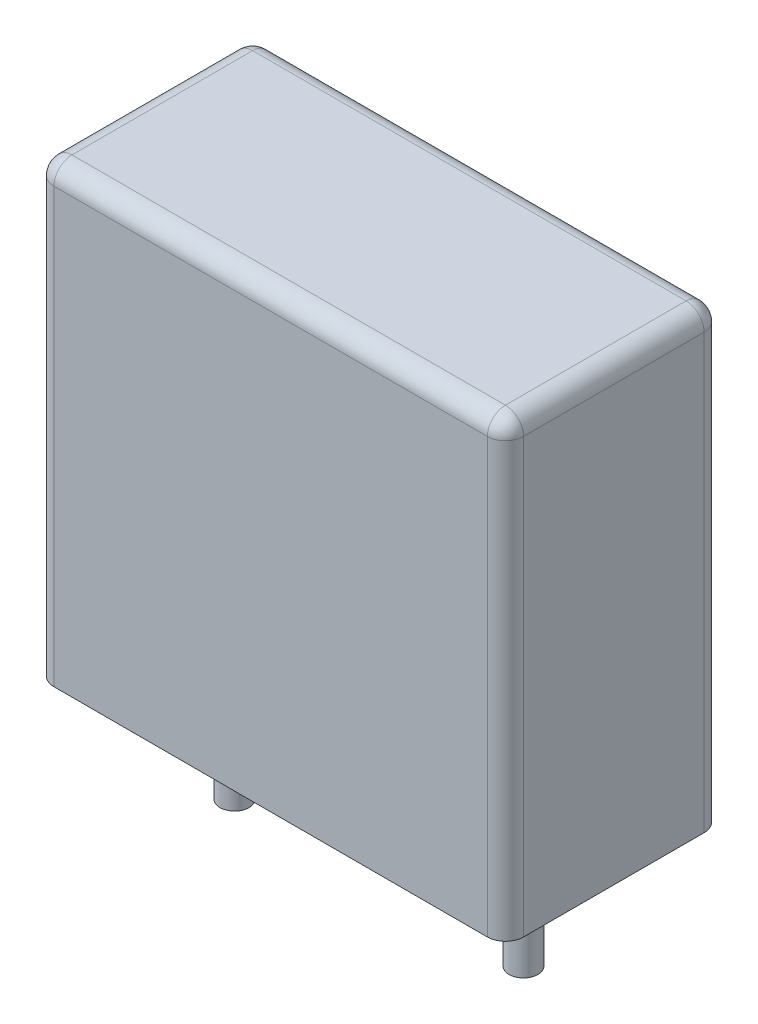
ISO-10303-21;
HEADER;
FILE_DESCRIPTION(('STEP AP214'),'2;1');
FILE_NAME('part.step','',(''),(''),'','','');
FILE_SCHEMA(('AUTOMOTIVE_DESIGN { 1 0 10303 214 1 1 1 1 }'));
ENDSEC;
DATA;
#1=APPLICATION_CONTEXT('core data for automotive mechanical design processes');
#2=APPLICATION_PROTOCOL_DEFINITION('international standard','automotive_design',2000,#1);
#3=PRODUCT_CONTEXT('',#1,'mechanical');
#4=PRODUCT('Part','Part','',(#3));
#5=PRODUCT_RELATED_PRODUCT_CATEGORY('part','',(#4));
#6=PRODUCT_DEFINITION_FORMATION('','',#4);
#7=PRODUCT_DEFINITION_CONTEXT('part definition',#1,'design');
#8=PRODUCT_DEFINITION('design','',#6,#7);
#9=PRODUCT_DEFINITION_SHAPE('','',#8);
#10=(LENGTH_UNIT() NAMED_UNIT(*) SI_UNIT(.MILLI.,.METRE.));
#11=(NAMED_UNIT(*) PLANE_ANGLE_UNIT() SI_UNIT($,.RADIAN.));
#12=(NAMED_UNIT(*) SI_UNIT($,.STERADIAN.) SOLID_ANGLE_UNIT());
#13=UNCERTAINTY_MEASURE_WITH_UNIT(LENGTH_MEASURE(1.E-05),#10,'distance_accuracy_value','');
#14=(GEOMETRIC_REPRESENTATION_CONTEXT(3) GLOBAL_UNCERTAINTY_ASSIGNED_CONTEXT((#13)) GLOBAL_UNIT_ASSIGNED_CONTEXT((#10,
#11,#12)) REPRESENTATION_CONTEXT('',''));
#15=CARTESIAN_POINT('',(0.,0.,0.));
#16=DIRECTION('',(0.,0.,1.));
#17=DIRECTION('',(1.,0.,0.));
#18=AXIS2_PLACEMENT_3D('',#15,#16,#17);
#19=CARTESIAN_POINT('',(6.5,12.5,3.));
#20=DIRECTION('',(-1.,0.,0.));
#21=DIRECTION('',(0.,0.,1.));
#22=AXIS2_PLACEMENT_3D('',#19,#20,#21);
#23=PLANE('',#22);
#24=DIRECTION('',(0.,0.,-1.));
#25=VECTOR('',#24,1.);
#26=CARTESIAN_POINT('',(6.5,0.,3.));
#27=LINE('',#26,#25);
#28=CARTESIAN_POINT('',(6.5,0.,2.5));
#29=VERTEX_POINT('',#28);
#30=CARTESIAN_POINT('',(6.5,0.,-2.5));
#31=VERTEX_POINT('',#30);
#32=EDGE_CURVE('E252',#29,#31,#27,.T.);
#33=ORIENTED_EDGE('',*,*,#32,.T.);
#34=DIRECTION('',(0.,-1.,0.));
#35=VECTOR('',#34,1.);
#36=CARTESIAN_POINT('',(6.5,12.5,-2.5));
#37=LINE('',#36,#35);
#38=CARTESIAN_POINT('',(6.5,12.,-2.5));
#39=VERTEX_POINT('',#38);
#40=EDGE_CURVE('E57',#31,#39,#37,.F.);
#41=ORIENTED_EDGE('',*,*,#40,.T.);
#42=DIRECTION('',(0.,0.,-1.));
#43=VECTOR('',#42,1.);
#44=CARTESIAN_POINT('',(6.5,12.,3.));
#45=LINE('',#44,#43);
#46=CARTESIAN_POINT('',(6.5,12.,2.5));
#47=VERTEX_POINT('',#46);
#48=EDGE_CURVE('E62',#39,#47,#45,.F.);
#49=ORIENTED_EDGE('',*,*,#48,.T.);
#50=DIRECTION('',(0.,-1.,0.));
#51=VECTOR('',#50,1.);
#52=CARTESIAN_POINT('',(6.5,12.5,2.5));
#53=LINE('',#52,#51);
#54=EDGE_CURVE('E188',#47,#29,#53,.T.);
#55=ORIENTED_EDGE('',*,*,#54,.T.);
#56=EDGE_LOOP('',(#33,#41,#49,#55));
#57=FACE_BOUND('',#56,.T.);
#58=ADVANCED_FACE('F39',(#57),#23,.F.);
#59=CARTESIAN_POINT('',(-6.5,12.5,-3.));
#60=DIRECTION('',(0.,0.,1.));
#61=DIRECTION('',(1.,0.,0.));
#62=AXIS2_PLACEMENT_3D('',#59,#60,#61);
#63=PLANE('',#62);
#64=DIRECTION('',(-1.,0.,0.));
#65=VECTOR('',#64,1.);
#66=CARTESIAN_POINT('',(-6.5,0.,-3.));
#67=LINE('',#66,#65);
#68=CARTESIAN_POINT('',(5.99999999999999,0.,-3.));
#69=VERTEX_POINT('',#68);
#70=CARTESIAN_POINT('',(-6.,0.,-3.));
#71=VERTEX_POINT('',#70);
#72=EDGE_CURVE('E258',#69,#71,#67,.T.);
#73=ORIENTED_EDGE('',*,*,#72,.T.);
#74=DIRECTION('',(0.,-1.,0.));
#75=VECTOR('',#74,1.);
#76=CARTESIAN_POINT('',(-6.,12.5,-3.));
#77=LINE('',#76,#75);
#78=CARTESIAN_POINT('',(-6.,12.,-3.));
#79=VERTEX_POINT('',#78);
#80=EDGE_CURVE('E185',#71,#79,#77,.F.);
#81=ORIENTED_EDGE('',*,*,#80,.T.);
#82=DIRECTION('',(-1.,0.,0.));
#83=VECTOR('',#82,1.);
#84=CARTESIAN_POINT('',(-6.5,12.,-3.));
#85=LINE('',#84,#83);
#86=CARTESIAN_POINT('',(5.99999999999999,12.,-3.));
#87=VERTEX_POINT('',#86);
#88=EDGE_CURVE('E182',#79,#87,#85,.F.);
#89=ORIENTED_EDGE('',*,*,#88,.T.);
#90=DIRECTION('',(0.,-1.,0.));
#91=VECTOR('',#90,1.);
#92=CARTESIAN_POINT('',(5.99999999999999,12.5,-3.));
#93=LINE('',#92,#91);
#94=EDGE_CURVE('E179',#87,#69,#93,.T.);
#95=ORIENTED_EDGE('',*,*,#94,.T.);
#96=EDGE_LOOP('',(#73,#81,#89,#95));
#97=FACE_BOUND('',#96,.T.);
#98=ADVANCED_FACE('F313',(#97),#63,.F.);
#99=CARTESIAN_POINT('',(-6.5,12.5,3.));
#100=DIRECTION('',(1.,0.,0.));
#101=DIRECTION('',(0.,0.,-1.));
#102=AXIS2_PLACEMENT_3D('',#99,#100,#101);
#103=PLANE('',#102);
#104=DIRECTION('',(0.,0.,1.));
#105=VECTOR('',#104,1.);
#106=CARTESIAN_POINT('',(-6.5,12.,3.));
#107=LINE('',#106,#105);
#108=CARTESIAN_POINT('',(-6.5,12.,2.5));
#109=VERTEX_POINT('',#108);
#110=CARTESIAN_POINT('',(-6.5,12.,-2.5));
#111=VERTEX_POINT('',#110);
#112=EDGE_CURVE('E173',#109,#111,#107,.F.);
#113=ORIENTED_EDGE('',*,*,#112,.T.);
#114=DIRECTION('',(0.,-1.,0.));
#115=VECTOR('',#114,1.);
#116=CARTESIAN_POINT('',(-6.5,12.5,-2.5));
#117=LINE('',#116,#115);
#118=CARTESIAN_POINT('',(-6.5,0.,-2.5));
#119=VERTEX_POINT('',#118);
#120=EDGE_CURVE('E176',#111,#119,#117,.T.);
#121=ORIENTED_EDGE('',*,*,#120,.T.);
#122=DIRECTION('',(0.,0.,1.));
#123=VECTOR('',#122,1.);
#124=CARTESIAN_POINT('',(-6.5,0.,3.));
#125=LINE('',#124,#123);
#126=CARTESIAN_POINT('',(-6.5,0.,2.5));
#127=VERTEX_POINT('',#126);
#128=EDGE_CURVE('E262',#119,#127,#125,.T.);
#129=ORIENTED_EDGE('',*,*,#128,.T.);
#130=DIRECTION('',(0.,-1.,0.));
#131=VECTOR('',#130,1.);
#132=CARTESIAN_POINT('',(-6.5,12.5,2.5));
#133=LINE('',#132,#131);
#134=EDGE_CURVE('E170',#127,#109,#133,.F.);
#135=ORIENTED_EDGE('',*,*,#134,.T.);
#136=EDGE_LOOP('',(#113,#121,#129,#135));
#137=FACE_BOUND('',#136,.T.);
#138=ADVANCED_FACE('F318',(#137),#103,.F.);
#139=CARTESIAN_POINT('',(-6.5,12.5,3.));
#140=DIRECTION('',(0.,0.,-1.));
#141=DIRECTION('',(-1.,0.,0.));
#142=AXIS2_PLACEMENT_3D('',#139,#140,#141);
#143=PLANE('',#142);
#144=DIRECTION('',(1.,0.,0.));
#145=VECTOR('',#144,1.);
#146=CARTESIAN_POINT('',(-6.5,0.,3.));
#147=LINE('',#146,#145);
#148=CARTESIAN_POINT('',(-6.,0.,3.));
#149=VERTEX_POINT('',#148);
#150=CARTESIAN_POINT('',(5.99999999999999,0.,3.));
#151=VERTEX_POINT('',#150);
#152=EDGE_CURVE('E150',#149,#151,#147,.T.);
#153=ORIENTED_EDGE('',*,*,#152,.T.);
#154=DIRECTION('',(0.,-1.,0.));
#155=VECTOR('',#154,1.);
#156=CARTESIAN_POINT('',(5.99999999999999,12.5,3.));
#157=LINE('',#156,#155);
#158=CARTESIAN_POINT('',(5.99999999999999,12.,3.));
#159=VERTEX_POINT('',#158);
#160=EDGE_CURVE('E167',#151,#159,#157,.F.);
#161=ORIENTED_EDGE('',*,*,#160,.T.);
#162=DIRECTION('',(1.,0.,0.));
#163=VECTOR('',#162,1.);
#164=CARTESIAN_POINT('',(-6.5,12.,3.));
#165=LINE('',#164,#163);
#166=CARTESIAN_POINT('',(-6.,12.,3.));
#167=VERTEX_POINT('',#166);
#168=EDGE_CURVE('E125',#159,#167,#165,.F.);
#169=ORIENTED_EDGE('',*,*,#168,.T.);
#170=DIRECTION('',(0.,-1.,0.));
#171=VECTOR('',#170,1.);
#172=CARTESIAN_POINT('',(-6.,12.5,3.));
#173=LINE('',#172,#171);
#174=EDGE_CURVE('E157',#167,#149,#173,.T.);
#175=ORIENTED_EDGE('',*,*,#174,.T.);
#176=EDGE_LOOP('',(#153,#161,#169,#175));
#177=FACE_BOUND('',#176,.T.);
#178=ADVANCED_FACE('F288',(#177),#143,.F.);
#179=CARTESIAN_POINT('',(0.,12.5,0.));
#180=DIRECTION('',(0.,-1.,0.));
#181=DIRECTION('',(0.,0.,-1.));
#182=AXIS2_PLACEMENT_3D('',#179,#180,#181);
#183=PLANE('',#182);
#184=DIRECTION('',(0.,0.,1.));
#185=VECTOR('',#184,1.);
#186=CARTESIAN_POINT('',(-6.,12.5,0.));
#187=LINE('',#186,#185);
#188=CARTESIAN_POINT('',(-6.,12.5,-2.5));
#189=VERTEX_POINT('',#188);
#190=CARTESIAN_POINT('',(-6.,12.5,2.5));
#191=VERTEX_POINT('',#190);
#192=EDGE_CURVE('E154',#189,#191,#187,.T.);
#193=ORIENTED_EDGE('',*,*,#192,.T.);
#194=DIRECTION('',(1.,0.,0.));
#195=VECTOR('',#194,1.);
#196=CARTESIAN_POINT('',(0.,12.5,2.5));
#197=LINE('',#196,#195);
#198=CARTESIAN_POINT('',(5.99999999999999,12.5,2.5));
#199=VERTEX_POINT('',#198);
#200=EDGE_CURVE('E123',#191,#199,#197,.T.);
#201=ORIENTED_EDGE('',*,*,#200,.T.);
#202=DIRECTION('',(0.,0.,-1.));
#203=VECTOR('',#202,1.);
#204=CARTESIAN_POINT('',(5.99999999999999,12.5,0.));
#205=LINE('',#204,#203);
#206=CARTESIAN_POINT('',(5.99999999999999,12.5,-2.5));
#207=VERTEX_POINT('',#206);
#208=EDGE_CURVE('E142',#199,#207,#205,.T.);
#209=ORIENTED_EDGE('',*,*,#208,.T.);
#210=DIRECTION('',(-1.,0.,0.));
#211=VECTOR('',#210,1.);
#212=CARTESIAN_POINT('',(0.,12.5,-2.5));
#213=LINE('',#212,#211);
#214=EDGE_CURVE('E149',#207,#189,#213,.T.);
#215=ORIENTED_EDGE('',*,*,#214,.T.);
#216=EDGE_LOOP('',(#193,#201,#209,#215));
#217=FACE_BOUND('',#216,.T.);
#218=ADVANCED_FACE('F152',(#217),#183,.F.);
#219=CARTESIAN_POINT('',(0.,0.,0.));
#220=DIRECTION('',(0.,-1.,0.));
#221=DIRECTION('',(0.,0.,-1.));
#222=AXIS2_PLACEMENT_3D('',#219,#220,#221);
#223=PLANE('',#222);
#224=CARTESIAN_POINT('',(4.,0.,0.));
#225=DIRECTION('',(0.,-1.,0.));
#226=DIRECTION('',(0.,0.,-1.));
#227=AXIS2_PLACEMENT_3D('',#224,#225,#226);
#228=CIRCLE('',#227,0.4);
#229=CARTESIAN_POINT('',(4.,0.,-0.399999999999999));
#230=VERTEX_POINT('',#229);
#231=EDGE_CURVE('E235',#230,#230,#228,.T.);
#232=ORIENTED_EDGE('',*,*,#231,.F.);
#233=EDGE_LOOP('',(#232));
#234=FACE_BOUND('',#233,.T.);
#235=CARTESIAN_POINT('',(-4.,0.,0.));
#236=DIRECTION('',(0.,-1.,0.));
#237=DIRECTION('',(0.,0.,-1.));
#238=AXIS2_PLACEMENT_3D('',#235,#236,#237);
#239=CIRCLE('',#238,0.4);
#240=CARTESIAN_POINT('',(-4.,0.,-0.4));
#241=VERTEX_POINT('',#240);
#242=EDGE_CURVE('E245',#241,#241,#239,.T.);
#243=ORIENTED_EDGE('',*,*,#242,.F.);
#244=EDGE_LOOP('',(#243));
#245=FACE_BOUND('',#244,.T.);
#246=ORIENTED_EDGE('',*,*,#128,.F.);
#247=CARTESIAN_POINT('',(-6.,0.,-2.5));
#248=DIRECTION('',(0.,-1.,0.));
#249=DIRECTION('',(0.,0.,-1.));
#250=AXIS2_PLACEMENT_3D('',#247,#248,#249);
#251=CIRCLE('',#250,0.5);
#252=EDGE_CURVE('E11',#119,#71,#251,.T.);
#253=ORIENTED_EDGE('',*,*,#252,.T.);
#254=ORIENTED_EDGE('',*,*,#72,.F.);
#255=CARTESIAN_POINT('',(5.99999999999999,0.,-2.5));
#256=DIRECTION('',(0.,-1.,0.));
#257=DIRECTION('',(0.,0.,-1.));
#258=AXIS2_PLACEMENT_3D('',#255,#256,#257);
#259=CIRCLE('',#258,0.5);
#260=EDGE_CURVE('E49',#69,#31,#259,.T.);
#261=ORIENTED_EDGE('',*,*,#260,.T.);
#262=ORIENTED_EDGE('',*,*,#32,.F.);
#263=CARTESIAN_POINT('',(5.99999999999999,0.,2.5));
#264=DIRECTION('',(0.,-1.,0.));
#265=DIRECTION('',(0.,0.,-1.));
#266=AXIS2_PLACEMENT_3D('',#263,#264,#265);
#267=CIRCLE('',#266,0.5);
#268=EDGE_CURVE('E198',#29,#151,#267,.T.);
#269=ORIENTED_EDGE('',*,*,#268,.T.);
#270=ORIENTED_EDGE('',*,*,#152,.F.);
#271=CARTESIAN_POINT('',(-6.,0.,2.5));
#272=DIRECTION('',(0.,-1.,0.));
#273=DIRECTION('',(0.,0.,-1.));
#274=AXIS2_PLACEMENT_3D('',#271,#272,#273);
#275=CIRCLE('',#274,0.5);
#276=EDGE_CURVE('E195',#149,#127,#275,.T.);
#277=ORIENTED_EDGE('',*,*,#276,.T.);
#278=EDGE_LOOP('',(#246,#253,#254,#261,#262,#269,#270,#277));
#279=FACE_BOUND('',#278,.T.);
#280=ADVANCED_FACE('F296',(#234,#245,#279),#223,.T.);
#281=CARTESIAN_POINT('',(-4.,-3.2,0.));
#282=DIRECTION('',(0.,1.,0.));
#283=DIRECTION('',(0.,0.,1.));
#284=AXIS2_PLACEMENT_3D('',#281,#282,#283);
#285=CYLINDRICAL_SURFACE('',#284,0.4);
#286=CARTESIAN_POINT('',(-4.,-3.2,0.));
#287=DIRECTION('',(0.,-1.,0.));
#288=DIRECTION('',(0.,0.,-1.));
#289=AXIS2_PLACEMENT_3D('',#286,#287,#288);
#290=CIRCLE('',#289,0.4);
#291=CARTESIAN_POINT('',(-4.,-3.2,-0.4));
#292=VERTEX_POINT('',#291);
#293=EDGE_CURVE('E248',#292,#292,#290,.T.);
#294=ORIENTED_EDGE('',*,*,#293,.F.);
#295=EDGE_LOOP('',(#294));
#296=FACE_BOUND('',#295,.T.);
#297=ORIENTED_EDGE('',*,*,#242,.T.);
#298=EDGE_LOOP('',(#297));
#299=FACE_BOUND('',#298,.T.);
#300=ADVANCED_FACE('F431',(#296,#299),#285,.T.);
#301=CARTESIAN_POINT('',(-4.,-3.2,0.));
#302=DIRECTION('',(0.,-1.,0.));
#303=DIRECTION('',(0.,0.,-1.));
#304=AXIS2_PLACEMENT_3D('',#301,#302,#303);
#305=PLANE('',#304);
#306=ORIENTED_EDGE('',*,*,#293,.T.);
#307=EDGE_LOOP('',(#306));
#308=FACE_BOUND('',#307,.T.);
#309=ADVANCED_FACE('F422',(#308),#305,.T.);
#310=CARTESIAN_POINT('',(4.,-3.2,0.));
#311=DIRECTION('',(0.,1.,0.));
#312=DIRECTION('',(0.,0.,1.));
#313=AXIS2_PLACEMENT_3D('',#310,#311,#312);
#314=CYLINDRICAL_SURFACE('',#313,0.4);
#315=CARTESIAN_POINT('',(4.,-3.2,0.));
#316=DIRECTION('',(0.,-1.,0.));
#317=DIRECTION('',(0.,0.,-1.));
#318=AXIS2_PLACEMENT_3D('',#315,#316,#317);
#319=CIRCLE('',#318,0.4);
#320=CARTESIAN_POINT('',(4.,-3.2,-0.399999999999999));
#321=VERTEX_POINT('',#320);
#322=EDGE_CURVE('E239',#321,#321,#319,.T.);
#323=ORIENTED_EDGE('',*,*,#322,.F.);
#324=EDGE_LOOP('',(#323));
#325=FACE_BOUND('',#324,.T.);
#326=ORIENTED_EDGE('',*,*,#231,.T.);
#327=EDGE_LOOP('',(#326));
#328=FACE_BOUND('',#327,.T.);
#329=ADVANCED_FACE('F413',(#325,#328),#314,.T.);
#330=CARTESIAN_POINT('',(4.,-3.2,0.));
#331=DIRECTION('',(0.,-1.,0.));
#332=DIRECTION('',(0.,0.,-1.));
#333=AXIS2_PLACEMENT_3D('',#330,#331,#332);
#334=PLANE('',#333);
#335=ORIENTED_EDGE('',*,*,#322,.T.);
#336=EDGE_LOOP('',(#335));
#337=FACE_BOUND('',#336,.T.);
#338=ADVANCED_FACE('F404',(#337),#334,.T.);
#339=CARTESIAN_POINT('',(-6.,12.5,-2.5));
#340=DIRECTION('',(0.,-1.,0.));
#341=DIRECTION('',(0.,0.,-1.));
#342=AXIS2_PLACEMENT_3D('',#339,#340,#341);
#343=CYLINDRICAL_SURFACE('',#342,0.5);
#344=ORIENTED_EDGE('',*,*,#252,.F.);
#345=ORIENTED_EDGE('',*,*,#120,.F.);
#346=CARTESIAN_POINT('',(-6.,12.,-2.5));
#347=DIRECTION('',(0.,1.,0.));
#348=DIRECTION('',(0.,0.,1.));
#349=AXIS2_PLACEMENT_3D('',#346,#347,#348);
#350=CIRCLE('',#349,0.5);
#351=EDGE_CURVE('E43',#79,#111,#350,.T.);
#352=ORIENTED_EDGE('',*,*,#351,.F.);
#353=ORIENTED_EDGE('',*,*,#80,.F.);
#354=EDGE_LOOP('',(#344,#345,#352,#353));
#355=FACE_BOUND('',#354,.T.);
#356=ADVANCED_FACE('F41',(#355),#343,.T.);
#357=CARTESIAN_POINT('',(0.,12.,-2.5));
#358=DIRECTION('',(-1.,0.,0.));
#359=DIRECTION('',(0.,0.,1.));
#360=AXIS2_PLACEMENT_3D('',#357,#358,#359);
#361=CYLINDRICAL_SURFACE('',#360,0.5);
#362=CARTESIAN_POINT('',(5.99999999999999,12.,-2.5));
#363=DIRECTION('',(1.,0.,0.));
#364=DIRECTION('',(0.,0.,-1.));
#365=AXIS2_PLACEMENT_3D('',#362,#363,#364);
#366=CIRCLE('',#365,0.5);
#367=EDGE_CURVE('E224',#87,#207,#366,.T.);
#368=ORIENTED_EDGE('',*,*,#367,.F.);
#369=ORIENTED_EDGE('',*,*,#88,.F.);
#370=CARTESIAN_POINT('',(-6.,12.,-2.5));
#371=DIRECTION('',(-1.,0.,0.));
#372=DIRECTION('',(0.,0.,1.));
#373=AXIS2_PLACEMENT_3D('',#370,#371,#372);
#374=CIRCLE('',#373,0.5);
#375=EDGE_CURVE('E227',#189,#79,#374,.T.);
#376=ORIENTED_EDGE('',*,*,#375,.F.);
#377=ORIENTED_EDGE('',*,*,#214,.F.);
#378=EDGE_LOOP('',(#368,#369,#376,#377));
#379=FACE_BOUND('',#378,.T.);
#380=ADVANCED_FACE('F272',(#379),#361,.T.);
#381=CARTESIAN_POINT('',(5.99999999999999,12.5,-2.5));
#382=DIRECTION('',(0.,-1.,0.));
#383=DIRECTION('',(0.,0.,-1.));
#384=AXIS2_PLACEMENT_3D('',#381,#382,#383);
#385=CYLINDRICAL_SURFACE('',#384,0.5);
#386=ORIENTED_EDGE('',*,*,#260,.F.);
#387=ORIENTED_EDGE('',*,*,#94,.F.);
#388=CARTESIAN_POINT('',(5.99999999999999,12.,-2.5));
#389=DIRECTION('',(0.,1.,0.));
#390=DIRECTION('',(0.,0.,1.));
#391=AXIS2_PLACEMENT_3D('',#388,#389,#390);
#392=CIRCLE('',#391,0.5);
#393=EDGE_CURVE('E220',#39,#87,#392,.T.);
#394=ORIENTED_EDGE('',*,*,#393,.F.);
#395=ORIENTED_EDGE('',*,*,#40,.F.);
#396=EDGE_LOOP('',(#386,#387,#394,#395));
#397=FACE_BOUND('',#396,.T.);
#398=ADVANCED_FACE('F301',(#397),#385,.T.);
#399=CARTESIAN_POINT('',(-6.,12.,-2.5));
#400=DIRECTION('',(0.,0.,1.));
#401=DIRECTION('',(1.,0.,0.));
#402=AXIS2_PLACEMENT_3D('',#399,#400,#401);
#403=SPHERICAL_SURFACE('',#402,0.5);
#404=ORIENTED_EDGE('',*,*,#375,.T.);
#405=ORIENTED_EDGE('',*,*,#351,.T.);
#406=CARTESIAN_POINT('',(-6.,12.,-2.5));
#407=DIRECTION('',(0.,0.,-1.));
#408=DIRECTION('',(0.,1.,0.));
#409=AXIS2_PLACEMENT_3D('',#406,#407,#408);
#410=CIRCLE('',#409,0.5);
#411=EDGE_CURVE('E216',#189,#111,#410,.F.);
#412=ORIENTED_EDGE('',*,*,#411,.F.);
#413=EDGE_LOOP('',(#404,#405,#412));
#414=FACE_BOUND('',#413,.T.);
#415=ADVANCED_FACE('F273',(#414),#403,.T.);
#416=CARTESIAN_POINT('',(5.99999999999999,12.,-2.5));
#417=DIRECTION('',(0.,0.,1.));
#418=DIRECTION('',(1.,0.,0.));
#419=AXIS2_PLACEMENT_3D('',#416,#417,#418);
#420=SPHERICAL_SURFACE('',#419,0.5);
#421=ORIENTED_EDGE('',*,*,#393,.T.);
#422=ORIENTED_EDGE('',*,*,#367,.T.);
#423=CARTESIAN_POINT('',(5.99999999999999,12.,-2.5));
#424=DIRECTION('',(0.,0.,-1.));
#425=DIRECTION('',(-1.,0.,0.));
#426=AXIS2_PLACEMENT_3D('',#423,#424,#425);
#427=CIRCLE('',#426,0.5);
#428=EDGE_CURVE('E145',#39,#207,#427,.F.);
#429=ORIENTED_EDGE('',*,*,#428,.F.);
#430=EDGE_LOOP('',(#421,#422,#429));
#431=FACE_BOUND('',#430,.T.);
#432=ADVANCED_FACE('F303',(#431),#420,.T.);
#433=CARTESIAN_POINT('',(-6.,12.5,2.5));
#434=DIRECTION('',(0.,-1.,0.));
#435=DIRECTION('',(0.,0.,-1.));
#436=AXIS2_PLACEMENT_3D('',#433,#434,#435);
#437=CYLINDRICAL_SURFACE('',#436,0.5);
#438=ORIENTED_EDGE('',*,*,#276,.F.);
#439=ORIENTED_EDGE('',*,*,#174,.F.);
#440=CARTESIAN_POINT('',(-6.,12.,2.5));
#441=DIRECTION('',(0.,1.,0.));
#442=DIRECTION('',(0.,0.,1.));
#443=AXIS2_PLACEMENT_3D('',#440,#441,#442);
#444=CIRCLE('',#443,0.5);
#445=EDGE_CURVE('E210',#109,#167,#444,.T.);
#446=ORIENTED_EDGE('',*,*,#445,.F.);
#447=ORIENTED_EDGE('',*,*,#134,.F.);
#448=EDGE_LOOP('',(#438,#439,#446,#447));
#449=FACE_BOUND('',#448,.T.);
#450=ADVANCED_FACE('F285',(#449),#437,.T.);
#451=CARTESIAN_POINT('',(-6.,12.,0.));
#452=DIRECTION('',(0.,0.,1.));
#453=DIRECTION('',(1.,0.,0.));
#454=AXIS2_PLACEMENT_3D('',#451,#452,#453);
#455=CYLINDRICAL_SURFACE('',#454,0.5);
#456=ORIENTED_EDGE('',*,*,#411,.T.);
#457=ORIENTED_EDGE('',*,*,#112,.F.);
#458=CARTESIAN_POINT('',(-6.,12.,2.5));
#459=DIRECTION('',(0.,0.,1.));
#460=DIRECTION('',(1.,0.,0.));
#461=AXIS2_PLACEMENT_3D('',#458,#459,#460);
#462=CIRCLE('',#461,0.5);
#463=EDGE_CURVE('E139',#191,#109,#462,.T.);
#464=ORIENTED_EDGE('',*,*,#463,.F.);
#465=ORIENTED_EDGE('',*,*,#192,.F.);
#466=EDGE_LOOP('',(#456,#457,#464,#465));
#467=FACE_BOUND('',#466,.T.);
#468=ADVANCED_FACE('F276',(#467),#455,.T.);
#469=CARTESIAN_POINT('',(5.99999999999999,12.,0.));
#470=DIRECTION('',(0.,0.,-1.));
#471=DIRECTION('',(-1.,0.,0.));
#472=AXIS2_PLACEMENT_3D('',#469,#470,#471);
#473=CYLINDRICAL_SURFACE('',#472,0.5);
#474=ORIENTED_EDGE('',*,*,#428,.T.);
#475=ORIENTED_EDGE('',*,*,#208,.F.);
#476=CARTESIAN_POINT('',(5.99999999999999,12.,2.5));
#477=DIRECTION('',(0.,0.,1.));
#478=DIRECTION('',(1.,0.,0.));
#479=AXIS2_PLACEMENT_3D('',#476,#477,#478);
#480=CIRCLE('',#479,0.5);
#481=EDGE_CURVE('E132',#47,#199,#480,.T.);
#482=ORIENTED_EDGE('',*,*,#481,.F.);
#483=ORIENTED_EDGE('',*,*,#48,.F.);
#484=EDGE_LOOP('',(#474,#475,#482,#483));
#485=FACE_BOUND('',#484,.T.);
#486=ADVANCED_FACE('F143',(#485),#473,.T.);
#487=CARTESIAN_POINT('',(5.99999999999999,12.5,2.5));
#488=DIRECTION('',(0.,-1.,0.));
#489=DIRECTION('',(0.,0.,-1.));
#490=AXIS2_PLACEMENT_3D('',#487,#488,#489);
#491=CYLINDRICAL_SURFACE('',#490,0.5);
#492=ORIENTED_EDGE('',*,*,#268,.F.);
#493=ORIENTED_EDGE('',*,*,#54,.F.);
#494=CARTESIAN_POINT('',(5.99999999999999,12.,2.5));
#495=DIRECTION('',(0.,1.,0.));
#496=DIRECTION('',(0.,0.,1.));
#497=AXIS2_PLACEMENT_3D('',#494,#495,#496);
#498=CIRCLE('',#497,0.5);
#499=EDGE_CURVE('E136',#159,#47,#498,.T.);
#500=ORIENTED_EDGE('',*,*,#499,.F.);
#501=ORIENTED_EDGE('',*,*,#160,.F.);
#502=EDGE_LOOP('',(#492,#493,#500,#501));
#503=FACE_BOUND('',#502,.T.);
#504=ADVANCED_FACE('F292',(#503),#491,.T.);
#505=CARTESIAN_POINT('',(-6.,12.,2.5));
#506=DIRECTION('',(0.,0.,1.));
#507=DIRECTION('',(1.,0.,0.));
#508=AXIS2_PLACEMENT_3D('',#505,#506,#507);
#509=SPHERICAL_SURFACE('',#508,0.5);
#510=ORIENTED_EDGE('',*,*,#463,.T.);
#511=ORIENTED_EDGE('',*,*,#445,.T.);
#512=CARTESIAN_POINT('',(-6.,12.,2.5));
#513=DIRECTION('',(-1.,0.,0.));
#514=DIRECTION('',(0.,0.,1.));
#515=AXIS2_PLACEMENT_3D('',#512,#513,#514);
#516=CIRCLE('',#515,0.5);
#517=EDGE_CURVE('E129',#191,#167,#516,.F.);
#518=ORIENTED_EDGE('',*,*,#517,.F.);
#519=EDGE_LOOP('',(#510,#511,#518));
#520=FACE_BOUND('',#519,.T.);
#521=ADVANCED_FACE('F280',(#520),#509,.T.);
#522=CARTESIAN_POINT('',(5.99999999999999,12.,2.5));
#523=DIRECTION('',(0.,0.,1.));
#524=DIRECTION('',(1.,0.,0.));
#525=AXIS2_PLACEMENT_3D('',#522,#523,#524);
#526=SPHERICAL_SURFACE('',#525,0.5);
#527=ORIENTED_EDGE('',*,*,#499,.T.);
#528=ORIENTED_EDGE('',*,*,#481,.T.);
#529=CARTESIAN_POINT('',(5.99999999999999,12.,2.5));
#530=DIRECTION('',(1.,0.,0.));
#531=DIRECTION('',(0.,0.,-1.));
#532=AXIS2_PLACEMENT_3D('',#529,#530,#531);
#533=CIRCLE('',#532,0.5);
#534=EDGE_CURVE('E119',#159,#199,#533,.F.);
#535=ORIENTED_EDGE('',*,*,#534,.F.);
#536=EDGE_LOOP('',(#527,#528,#535));
#537=FACE_BOUND('',#536,.T.);
#538=ADVANCED_FACE('F134',(#537),#526,.T.);
#539=CARTESIAN_POINT('',(0.,12.,2.5));
#540=DIRECTION('',(1.,0.,0.));
#541=DIRECTION('',(0.,0.,-1.));
#542=AXIS2_PLACEMENT_3D('',#539,#540,#541);
#543=CYLINDRICAL_SURFACE('',#542,0.5);
#544=ORIENTED_EDGE('',*,*,#517,.T.);
#545=ORIENTED_EDGE('',*,*,#168,.F.);
#546=ORIENTED_EDGE('',*,*,#534,.T.);
#547=ORIENTED_EDGE('',*,*,#200,.F.);
#548=EDGE_LOOP('',(#544,#545,#546,#547));
#549=FACE_BOUND('',#548,.T.);
#550=ADVANCED_FACE('F121',(#549),#543,.T.);
#551=CLOSED_SHELL('',(#58,#98,#138,#178,#218,#280,#300,#309,#329,#338,#356,#380,#398,#415,#432,
#450,#468,#486,#504,#521,#538,#550));
#552=MANIFOLD_SOLID_BREP('B2',#551);
#553=ADVANCED_BREP_SHAPE_REPRESENTATION('',(#18,#552),#14);
#554=SHAPE_DEFINITION_REPRESENTATION(#9,#553);
ENDSEC;
END-ISO-10303-21;
